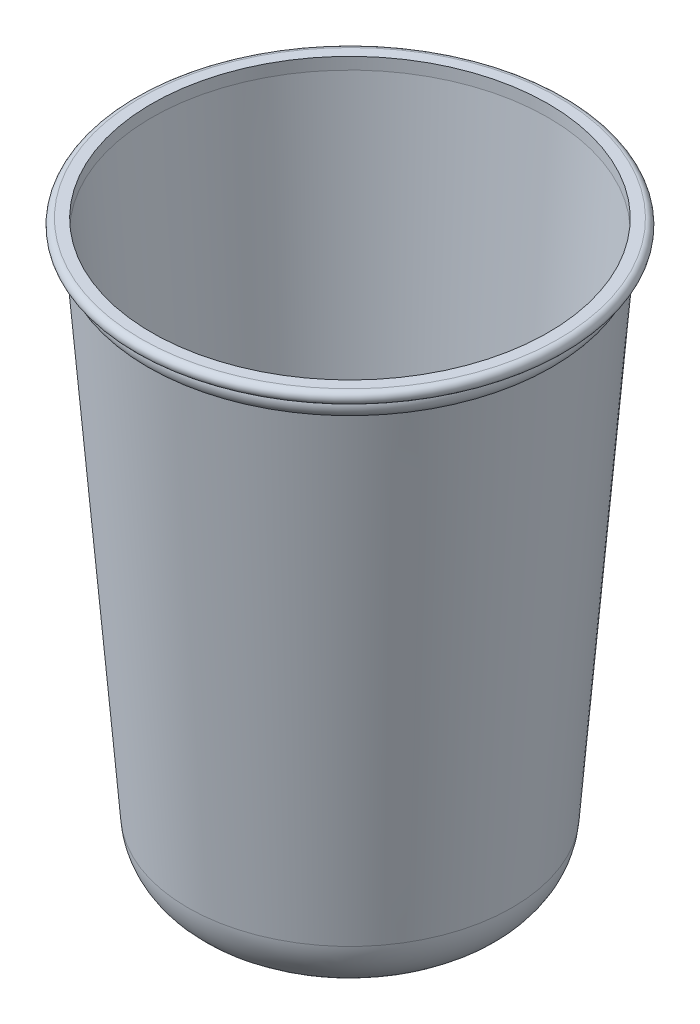
ISO-10303-21;
HEADER;
FILE_DESCRIPTION(('STEP AP214'),'2;1');
FILE_NAME('part.step','',(''),(''),'','','');
FILE_SCHEMA(('AUTOMOTIVE_DESIGN { 1 0 10303 214 1 1 1 1 }'));
ENDSEC;
DATA;
#1=APPLICATION_CONTEXT('core data for automotive mechanical design processes');
#2=APPLICATION_PROTOCOL_DEFINITION('international standard','automotive_design',2000,#1);
#3=PRODUCT_CONTEXT('',#1,'mechanical');
#4=PRODUCT('Part','Part','',(#3));
#5=PRODUCT_RELATED_PRODUCT_CATEGORY('part','',(#4));
#6=PRODUCT_DEFINITION_FORMATION('','',#4);
#7=PRODUCT_DEFINITION_CONTEXT('part definition',#1,'design');
#8=PRODUCT_DEFINITION('design','',#6,#7);
#9=PRODUCT_DEFINITION_SHAPE('','',#8);
#10=(LENGTH_UNIT() NAMED_UNIT(*) SI_UNIT(.MILLI.,.METRE.));
#11=(NAMED_UNIT(*) PLANE_ANGLE_UNIT() SI_UNIT($,.RADIAN.));
#12=(NAMED_UNIT(*) SI_UNIT($,.STERADIAN.) SOLID_ANGLE_UNIT());
#13=UNCERTAINTY_MEASURE_WITH_UNIT(LENGTH_MEASURE(1.E-05),#10,'distance_accuracy_value','');
#14=(GEOMETRIC_REPRESENTATION_CONTEXT(3) GLOBAL_UNCERTAINTY_ASSIGNED_CONTEXT((#13)) GLOBAL_UNIT_ASSIGNED_CONTEXT((#10,
#11,#12)) REPRESENTATION_CONTEXT('',''));
#15=CARTESIAN_POINT('',(0.,0.,0.));
#16=DIRECTION('',(0.,0.,1.));
#17=DIRECTION('',(1.,0.,0.));
#18=AXIS2_PLACEMENT_3D('',#15,#16,#17);
#19=CARTESIAN_POINT('',(0.,0.,0.));
#20=DIRECTION('',(0.,1.,0.));
#21=DIRECTION('',(0.,0.,1.));
#22=AXIS2_PLACEMENT_3D('',#19,#20,#21);
#23=PLANE('',#22);
#24=CARTESIAN_POINT('',(0.,0.,0.));
#25=DIRECTION('',(0.,1.,0.));
#26=DIRECTION('',(0.,0.,1.));
#27=AXIS2_PLACEMENT_3D('',#24,#25,#26);
#28=CIRCLE('',#27,18.5);
#29=CARTESIAN_POINT('',(0.,0.,18.5));
#30=VERTEX_POINT('',#29);
#31=EDGE_CURVE('E45',#30,#30,#28,.T.);
#32=ORIENTED_EDGE('',*,*,#31,.T.);
#33=EDGE_LOOP('',(#32));
#34=FACE_BOUND('',#33,.T.);
#35=CARTESIAN_POINT('',(0.,0.,0.));
#36=DIRECTION('',(0.,1.,0.));
#37=DIRECTION('',(0.,0.,1.));
#38=AXIS2_PLACEMENT_3D('',#35,#36,#37);
#39=CIRCLE('',#38,20.9980643459409);
#40=CARTESIAN_POINT('',(0.,0.,20.9980643459409));
#41=VERTEX_POINT('',#40);
#42=EDGE_CURVE('E54',#41,#41,#39,.T.);
#43=ORIENTED_EDGE('',*,*,#42,.F.);
#44=EDGE_LOOP('',(#43));
#45=FACE_BOUND('',#44,.T.);
#46=ADVANCED_FACE('F34',(#34,#45),#23,.F.);
#47=CARTESIAN_POINT('',(0.,13.,0.));
#48=DIRECTION('',(0.,1.,0.));
#49=DIRECTION('',(0.,0.,1.));
#50=AXIS2_PLACEMENT_3D('',#47,#48,#49);
#51=TOROIDAL_SURFACE('',#50,20.9980643459409,13.);
#52=CARTESIAN_POINT('',(0.,11.9637447815199,0.));
#53=DIRECTION('',(0.,1.,0.));
#54=DIRECTION('',(0.,0.,1.));
#55=AXIS2_PLACEMENT_3D('',#52,#53,#54);
#56=CIRCLE('',#55,33.956697573337);
#57=CARTESIAN_POINT('',(0.,11.9637447815199,33.956697573337));
#58=VERTEX_POINT('',#57);
#59=EDGE_CURVE('E57',#58,#58,#56,.T.);
#60=ORIENTED_EDGE('',*,*,#59,.F.);
#61=EDGE_LOOP('',(#60));
#62=FACE_BOUND('',#61,.T.);
#63=ORIENTED_EDGE('',*,*,#42,.T.);
#64=EDGE_LOOP('',(#63));
#65=FACE_BOUND('',#64,.T.);
#66=ADVANCED_FACE('F111',(#62,#65),#51,.T.);
#67=CARTESIAN_POINT('',(0.,11.9637447815199,0.));
#68=DIRECTION('',(0.,1.,0.));
#69=DIRECTION('',(0.,0.,1.));
#70=AXIS2_PLACEMENT_3D('',#67,#68,#69);
#71=CONICAL_SURFACE('',#70,33.956697573337,0.0797965970231983);
#72=CARTESIAN_POINT('',(0.,113.960565819977,0.));
#73=DIRECTION('',(0.,1.,0.));
#74=DIRECTION('',(0.,0.,1.));
#75=AXIS2_PLACEMENT_3D('',#72,#73,#74);
#76=CIRCLE('',#75,42.1130159299694);
#77=CARTESIAN_POINT('',(0.,113.960565819977,42.1130159299694));
#78=VERTEX_POINT('',#77);
#79=EDGE_CURVE('E60',#78,#78,#76,.T.);
#80=ORIENTED_EDGE('',*,*,#79,.F.);
#81=EDGE_LOOP('',(#80));
#82=FACE_BOUND('',#81,.T.);
#83=ORIENTED_EDGE('',*,*,#59,.T.);
#84=EDGE_LOOP('',(#83));
#85=FACE_BOUND('',#84,.T.);
#86=ADVANCED_FACE('F117',(#82,#85),#71,.T.);
#87=CARTESIAN_POINT('',(0.,115.87058666009,0.));
#88=DIRECTION('',(0.,1.,0.));
#89=DIRECTION('',(0.,0.,1.));
#90=AXIS2_PLACEMENT_3D('',#87,#88,#89);
#91=TOROIDAL_SURFACE('',#90,40.5,2.5);
#92=CARTESIAN_POINT('',(0.,117.5,0.));
#93=DIRECTION('',(0.,1.,0.));
#94=DIRECTION('',(0.,0.,1.));
#95=AXIS2_PLACEMENT_3D('',#92,#93,#94);
#96=CIRCLE('',#95,42.3960517312885);
#97=CARTESIAN_POINT('',(0.,117.5,42.3960517312885));
#98=VERTEX_POINT('',#97);
#99=EDGE_CURVE('E63',#98,#98,#96,.T.);
#100=ORIENTED_EDGE('',*,*,#99,.F.);
#101=EDGE_LOOP('',(#100));
#102=FACE_BOUND('',#101,.T.);
#103=ORIENTED_EDGE('',*,*,#79,.T.);
#104=EDGE_LOOP('',(#103));
#105=FACE_BOUND('',#104,.T.);
#106=ADVANCED_FACE('F149',(#102,#105),#91,.T.);
#107=CARTESIAN_POINT('',(42.3960517312885,117.5,0.));
#108=DIRECTION('',(0.,1.,0.));
#109=DIRECTION('',(0.,0.,1.));
#110=AXIS2_PLACEMENT_3D('',#107,#108,#109);
#111=PLANE('',#110);
#112=CARTESIAN_POINT('',(0.,117.5,0.));
#113=DIRECTION('',(0.,1.,0.));
#114=DIRECTION('',(0.,0.,1.));
#115=AXIS2_PLACEMENT_3D('',#112,#113,#114);
#116=CIRCLE('',#115,43.75);
#117=CARTESIAN_POINT('',(0.,117.5,43.75));
#118=VERTEX_POINT('',#117);
#119=EDGE_CURVE('E66',#118,#118,#116,.T.);
#120=ORIENTED_EDGE('',*,*,#119,.F.);
#121=EDGE_LOOP('',(#120));
#122=FACE_BOUND('',#121,.T.);
#123=ORIENTED_EDGE('',*,*,#99,.T.);
#124=EDGE_LOOP('',(#123));
#125=FACE_BOUND('',#124,.T.);
#126=ADVANCED_FACE('F145',(#122,#125),#111,.F.);
#127=CARTESIAN_POINT('',(0.,118.75,0.));
#128=DIRECTION('',(0.,1.,0.));
#129=DIRECTION('',(0.,0.,1.));
#130=AXIS2_PLACEMENT_3D('',#127,#128,#129);
#131=TOROIDAL_SURFACE('',#130,43.75,1.25);
#132=CARTESIAN_POINT('',(0.,120.,0.));
#133=DIRECTION('',(0.,1.,0.));
#134=DIRECTION('',(0.,0.,1.));
#135=AXIS2_PLACEMENT_3D('',#132,#133,#134);
#136=CIRCLE('',#135,43.75);
#137=CARTESIAN_POINT('',(0.,120.,43.75));
#138=VERTEX_POINT('',#137);
#139=EDGE_CURVE('E69',#138,#138,#136,.T.);
#140=ORIENTED_EDGE('',*,*,#139,.F.);
#141=EDGE_LOOP('',(#140));
#142=FACE_BOUND('',#141,.T.);
#143=ORIENTED_EDGE('',*,*,#119,.T.);
#144=EDGE_LOOP('',(#143));
#145=FACE_BOUND('',#144,.T.);
#146=ADVANCED_FACE('F139',(#142,#145),#131,.T.);
#147=CARTESIAN_POINT('',(0.,120.,0.));
#148=DIRECTION('',(0.,-1.,0.));
#149=DIRECTION('',(0.,0.,-1.));
#150=AXIS2_PLACEMENT_3D('',#147,#148,#149);
#151=PLANE('',#150);
#152=CARTESIAN_POINT('',(0.,120.,0.));
#153=DIRECTION('',(0.,-1.,0.));
#154=DIRECTION('',(0.,0.,-1.));
#155=AXIS2_PLACEMENT_3D('',#152,#153,#154);
#156=CIRCLE('',#155,41.5);
#157=CARTESIAN_POINT('',(0.,120.,-41.5));
#158=VERTEX_POINT('',#157);
#159=EDGE_CURVE('E72',#158,#158,#156,.T.);
#160=ORIENTED_EDGE('',*,*,#159,.T.);
#161=EDGE_LOOP('',(#160));
#162=FACE_BOUND('',#161,.T.);
#163=ORIENTED_EDGE('',*,*,#139,.T.);
#164=EDGE_LOOP('',(#163));
#165=FACE_BOUND('',#164,.T.);
#166=ADVANCED_FACE('F134',(#162,#165),#151,.F.);
#167=CARTESIAN_POINT('',(0.,5.,0.));
#168=DIRECTION('',(0.,-1.,0.));
#169=DIRECTION('',(0.,0.,-1.));
#170=AXIS2_PLACEMENT_3D('',#167,#168,#169);
#171=CYLINDRICAL_SURFACE('',#170,16.5);
#172=CARTESIAN_POINT('',(0.,4.,0.));
#173=DIRECTION('',(0.,-1.,0.));
#174=DIRECTION('',(0.,0.,-1.));
#175=AXIS2_PLACEMENT_3D('',#172,#173,#174);
#176=CIRCLE('',#175,16.5);
#177=CARTESIAN_POINT('',(0.,4.,-16.5));
#178=VERTEX_POINT('',#177);
#179=EDGE_CURVE('E10',#178,#178,#176,.F.);
#180=ORIENTED_EDGE('',*,*,#179,.T.);
#181=EDGE_LOOP('',(#180));
#182=FACE_BOUND('',#181,.T.);
#183=CARTESIAN_POINT('',(0.,2.,0.));
#184=DIRECTION('',(0.,1.,0.));
#185=DIRECTION('',(0.,0.,1.));
#186=AXIS2_PLACEMENT_3D('',#183,#184,#185);
#187=CIRCLE('',#186,16.5);
#188=CARTESIAN_POINT('',(0.,2.,16.5));
#189=VERTEX_POINT('',#188);
#190=EDGE_CURVE('E49',#189,#189,#187,.F.);
#191=ORIENTED_EDGE('',*,*,#190,.T.);
#192=EDGE_LOOP('',(#191));
#193=FACE_BOUND('',#192,.T.);
#194=ADVANCED_FACE('F128',(#182,#193),#171,.F.);
#195=CARTESIAN_POINT('',(0.,5.,0.));
#196=DIRECTION('',(0.,-1.,0.));
#197=DIRECTION('',(0.,0.,-1.));
#198=AXIS2_PLACEMENT_3D('',#195,#196,#197);
#199=PLANE('',#198);
#200=CARTESIAN_POINT('',(0.,5.,0.));
#201=DIRECTION('',(0.,-1.,0.));
#202=DIRECTION('',(0.,0.,-1.));
#203=AXIS2_PLACEMENT_3D('',#200,#201,#202);
#204=CIRCLE('',#203,15.5);
#205=CARTESIAN_POINT('',(0.,5.,-15.5));
#206=VERTEX_POINT('',#205);
#207=EDGE_CURVE('E41',#206,#206,#204,.T.);
#208=ORIENTED_EDGE('',*,*,#207,.T.);
#209=EDGE_LOOP('',(#208));
#210=FACE_BOUND('',#209,.T.);
#211=ADVANCED_FACE('F123',(#210),#199,.T.);
#212=CARTESIAN_POINT('',(0.,2.,0.));
#213=DIRECTION('',(0.,1.,0.));
#214=DIRECTION('',(0.,0.,1.));
#215=AXIS2_PLACEMENT_3D('',#212,#213,#214);
#216=TOROIDAL_SURFACE('',#215,18.5,2.);
#217=ORIENTED_EDGE('',*,*,#31,.F.);
#218=EDGE_LOOP('',(#217));
#219=FACE_BOUND('',#218,.T.);
#220=ORIENTED_EDGE('',*,*,#190,.F.);
#221=EDGE_LOOP('',(#220));
#222=FACE_BOUND('',#221,.T.);
#223=ADVANCED_FACE('F107',(#219,#222),#216,.T.);
#224=CARTESIAN_POINT('',(0.,4.,0.));
#225=DIRECTION('',(0.,-1.,0.));
#226=DIRECTION('',(0.,0.,-1.));
#227=AXIS2_PLACEMENT_3D('',#224,#225,#226);
#228=TOROIDAL_SURFACE('',#227,15.5,1.);
#229=ORIENTED_EDGE('',*,*,#179,.F.);
#230=EDGE_LOOP('',(#229));
#231=FACE_BOUND('',#230,.T.);
#232=ORIENTED_EDGE('',*,*,#207,.F.);
#233=EDGE_LOOP('',(#232));
#234=FACE_BOUND('',#233,.T.);
#235=ADVANCED_FACE('F36',(#231,#234),#228,.F.);
#236=CARTESIAN_POINT('',(0.,6.17307509738794,0.));
#237=DIRECTION('',(0.,-1.,0.));
#238=DIRECTION('',(0.,0.,-1.));
#239=AXIS2_PLACEMENT_3D('',#236,#237,#238);
#240=PLANE('',#239);
#241=CARTESIAN_POINT('',(0.,6.17307509738794,0.));
#242=DIRECTION('',(0.,-1.,0.));
#243=DIRECTION('',(0.,0.,-1.));
#244=AXIS2_PLACEMENT_3D('',#241,#242,#243);
#245=CIRCLE('',#244,15.5);
#246=CARTESIAN_POINT('',(0.,6.17307509738794,-15.5));
#247=VERTEX_POINT('',#246);
#248=EDGE_CURVE('E90',#247,#247,#245,.T.);
#249=ORIENTED_EDGE('',*,*,#248,.F.);
#250=EDGE_LOOP('',(#249));
#251=FACE_BOUND('',#250,.T.);
#252=ADVANCED_FACE('F96',(#251),#240,.F.);
#253=CARTESIAN_POINT('',(0.,6.17307509738794,0.));
#254=DIRECTION('',(0.,-1.,0.));
#255=DIRECTION('',(0.,0.,-1.));
#256=AXIS2_PLACEMENT_3D('',#253,#254,#255);
#257=CYLINDRICAL_SURFACE('',#256,41.5);
#258=ORIENTED_EDGE('',*,*,#159,.F.);
#259=EDGE_LOOP('',(#258));
#260=FACE_BOUND('',#259,.T.);
#261=CARTESIAN_POINT('',(0.,117.5,0.));
#262=DIRECTION('',(0.,-1.,0.));
#263=DIRECTION('',(0.,0.,-1.));
#264=AXIS2_PLACEMENT_3D('',#261,#262,#263);
#265=CIRCLE('',#264,41.5);
#266=CARTESIAN_POINT('',(0.,117.5,-41.5));
#267=VERTEX_POINT('',#266);
#268=EDGE_CURVE('E75',#267,#267,#265,.T.);
#269=ORIENTED_EDGE('',*,*,#268,.T.);
#270=EDGE_LOOP('',(#269));
#271=FACE_BOUND('',#270,.T.);
#272=ADVANCED_FACE('F98',(#260,#271),#257,.F.);
#273=CARTESIAN_POINT('',(0.,11.9637447815199,0.));
#274=DIRECTION('',(0.,1.,0.));
#275=DIRECTION('',(0.,0.,1.));
#276=AXIS2_PLACEMENT_3D('',#273,#274,#275);
#277=CONICAL_SURFACE('',#276,33.0606458420485,0.0797965970231981);
#278=ORIENTED_EDGE('',*,*,#268,.F.);
#279=EDGE_LOOP('',(#278));
#280=FACE_BOUND('',#279,.T.);
#281=CARTESIAN_POINT('',(0.,11.9637447815199,0.));
#282=DIRECTION('',(0.,-1.,0.));
#283=DIRECTION('',(0.,0.,-1.));
#284=AXIS2_PLACEMENT_3D('',#281,#282,#283);
#285=CIRCLE('',#284,33.0606458420485);
#286=CARTESIAN_POINT('',(0.,11.9637447815199,-33.0606458420485));
#287=VERTEX_POINT('',#286);
#288=EDGE_CURVE('E78',#287,#287,#285,.T.);
#289=ORIENTED_EDGE('',*,*,#288,.T.);
#290=EDGE_LOOP('',(#289));
#291=FACE_BOUND('',#290,.T.);
#292=ADVANCED_FACE('F104',(#280,#291),#277,.F.);
#293=CARTESIAN_POINT('',(0.,13.,0.));
#294=DIRECTION('',(0.,-1.,0.));
#295=DIRECTION('',(0.,0.,-1.));
#296=AXIS2_PLACEMENT_3D('',#293,#294,#295);
#297=TOROIDAL_SURFACE('',#296,20.9980643459409,12.1070102514231);
#298=ORIENTED_EDGE('',*,*,#288,.F.);
#299=EDGE_LOOP('',(#298));
#300=FACE_BOUND('',#299,.T.);
#301=CARTESIAN_POINT('',(0.,1.19360770353644,0.));
#302=DIRECTION('',(0.,-1.,0.));
#303=DIRECTION('',(0.,0.,-1.));
#304=AXIS2_PLACEMENT_3D('',#301,#302,#303);
#305=CIRCLE('',#304,18.3168709232148);
#306=CARTESIAN_POINT('',(0.,1.19360770353644,-18.3168709232148));
#307=VERTEX_POINT('',#306);
#308=EDGE_CURVE('E81',#307,#307,#305,.T.);
#309=ORIENTED_EDGE('',*,*,#308,.T.);
#310=EDGE_LOOP('',(#309));
#311=FACE_BOUND('',#310,.T.);
#312=ADVANCED_FACE('F207',(#300,#311),#297,.F.);
#313=CARTESIAN_POINT('',(0.,2.,0.));
#314=DIRECTION('',(0.,-1.,0.));
#315=DIRECTION('',(0.,0.,-1.));
#316=AXIS2_PLACEMENT_3D('',#313,#314,#315);
#317=TOROIDAL_SURFACE('',#316,18.5,0.826924902612058);
#318=ORIENTED_EDGE('',*,*,#308,.F.);
#319=EDGE_LOOP('',(#318));
#320=FACE_BOUND('',#319,.T.);
#321=CARTESIAN_POINT('',(0.,2.,0.));
#322=DIRECTION('',(0.,-1.,0.));
#323=DIRECTION('',(0.,0.,-1.));
#324=AXIS2_PLACEMENT_3D('',#321,#322,#323);
#325=CIRCLE('',#324,17.6730750973879);
#326=CARTESIAN_POINT('',(0.,2.,-17.6730750973879));
#327=VERTEX_POINT('',#326);
#328=EDGE_CURVE('E84',#327,#327,#325,.T.);
#329=ORIENTED_EDGE('',*,*,#328,.T.);
#330=EDGE_LOOP('',(#329));
#331=FACE_BOUND('',#330,.T.);
#332=ADVANCED_FACE('F217',(#320,#331),#317,.F.);
#333=CARTESIAN_POINT('',(0.,6.17307509738794,0.));
#334=DIRECTION('',(0.,-1.,0.));
#335=DIRECTION('',(0.,0.,-1.));
#336=AXIS2_PLACEMENT_3D('',#333,#334,#335);
#337=CYLINDRICAL_SURFACE('',#336,17.6730750973879);
#338=ORIENTED_EDGE('',*,*,#328,.F.);
#339=EDGE_LOOP('',(#338));
#340=FACE_BOUND('',#339,.T.);
#341=CARTESIAN_POINT('',(0.,4.,0.));
#342=DIRECTION('',(0.,-1.,0.));
#343=DIRECTION('',(0.,0.,-1.));
#344=AXIS2_PLACEMENT_3D('',#341,#342,#343);
#345=CIRCLE('',#344,17.6730750973879);
#346=CARTESIAN_POINT('',(0.,4.,-17.6730750973879));
#347=VERTEX_POINT('',#346);
#348=EDGE_CURVE('E87',#347,#347,#345,.T.);
#349=ORIENTED_EDGE('',*,*,#348,.T.);
#350=EDGE_LOOP('',(#349));
#351=FACE_BOUND('',#350,.T.);
#352=ADVANCED_FACE('F227',(#340,#351),#337,.T.);
#353=CARTESIAN_POINT('',(0.,4.,0.));
#354=DIRECTION('',(0.,-1.,0.));
#355=DIRECTION('',(0.,0.,-1.));
#356=AXIS2_PLACEMENT_3D('',#353,#354,#355);
#357=TOROIDAL_SURFACE('',#356,15.5,2.17307509738794);
#358=ORIENTED_EDGE('',*,*,#348,.F.);
#359=EDGE_LOOP('',(#358));
#360=FACE_BOUND('',#359,.T.);
#361=ORIENTED_EDGE('',*,*,#248,.T.);
#362=EDGE_LOOP('',(#361));
#363=FACE_BOUND('',#362,.T.);
#364=ADVANCED_FACE('F94',(#360,#363),#357,.T.);
#365=CLOSED_SHELL('',(#46,#66,#86,#106,#126,#146,#166,#194,#211,#223,#235,#252,#272,#292,#312,
#332,#352,#364));
#366=MANIFOLD_SOLID_BREP('B2',#365);
#367=ADVANCED_BREP_SHAPE_REPRESENTATION('',(#18,#366),#14);
#368=SHAPE_DEFINITION_REPRESENTATION(#9,#367);
ENDSEC;
END-ISO-10303-21;
